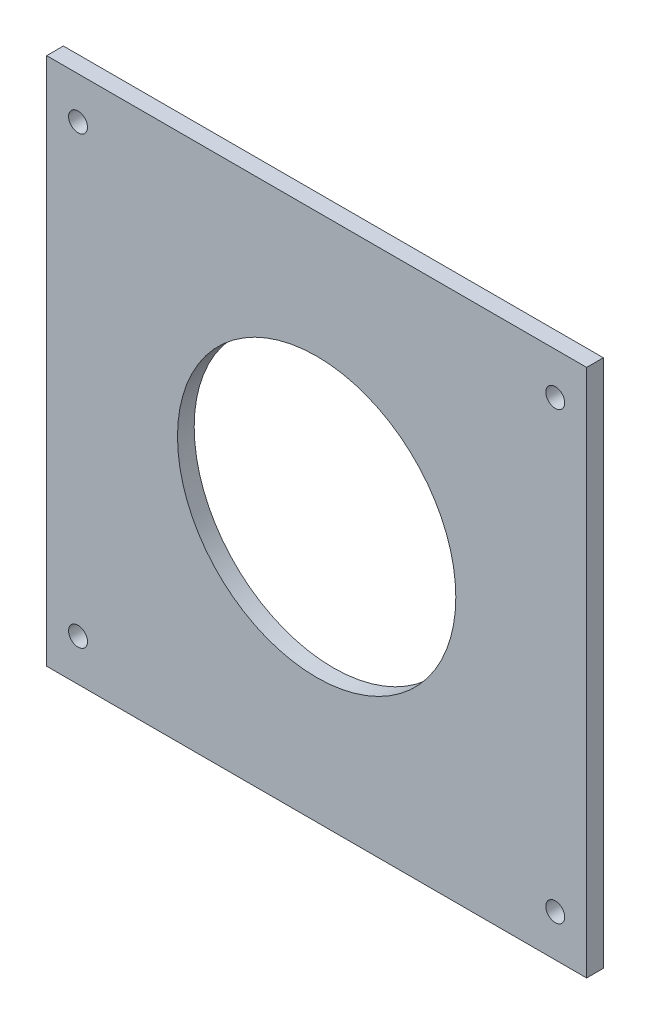
ISO-10303-21;
HEADER;
FILE_DESCRIPTION(('STEP AP214'),'2;1');
FILE_NAME('part.step','',(''),(''),'','','');
FILE_SCHEMA(('AUTOMOTIVE_DESIGN { 1 0 10303 214 1 1 1 1 }'));
ENDSEC;
DATA;
#1=APPLICATION_CONTEXT('core data for automotive mechanical design processes');
#2=APPLICATION_PROTOCOL_DEFINITION('international standard','automotive_design',2000,#1);
#3=PRODUCT_CONTEXT('',#1,'mechanical');
#4=PRODUCT('Part','Part','',(#3));
#5=PRODUCT_RELATED_PRODUCT_CATEGORY('part','',(#4));
#6=PRODUCT_DEFINITION_FORMATION('','',#4);
#7=PRODUCT_DEFINITION_CONTEXT('part definition',#1,'design');
#8=PRODUCT_DEFINITION('design','',#6,#7);
#9=PRODUCT_DEFINITION_SHAPE('','',#8);
#10=(LENGTH_UNIT() NAMED_UNIT(*) SI_UNIT(.MILLI.,.METRE.));
#11=(NAMED_UNIT(*) PLANE_ANGLE_UNIT() SI_UNIT($,.RADIAN.));
#12=(NAMED_UNIT(*) SI_UNIT($,.STERADIAN.) SOLID_ANGLE_UNIT());
#13=UNCERTAINTY_MEASURE_WITH_UNIT(LENGTH_MEASURE(1.E-05),#10,'distance_accuracy_value','');
#14=(GEOMETRIC_REPRESENTATION_CONTEXT(3) GLOBAL_UNCERTAINTY_ASSIGNED_CONTEXT((#13)) GLOBAL_UNIT_ASSIGNED_CONTEXT((#10,
#11,#12)) REPRESENTATION_CONTEXT('',''));
#15=CARTESIAN_POINT('',(0.,0.,0.));
#16=DIRECTION('',(0.,0.,1.));
#17=DIRECTION('',(1.,0.,0.));
#18=AXIS2_PLACEMENT_3D('',#15,#16,#17);
#19=CARTESIAN_POINT('',(0.,0.,3.));
#20=DIRECTION('',(1.,0.,0.));
#21=DIRECTION('',(0.,0.,-1.));
#22=AXIS2_PLACEMENT_3D('',#19,#20,#21);
#23=PLANE('',#22);
#24=DIRECTION('',(0.,-1.,0.));
#25=VECTOR('',#24,1.);
#26=CARTESIAN_POINT('',(0.,0.,0.));
#27=LINE('',#26,#25);
#28=CARTESIAN_POINT('',(0.,95.,0.));
#29=VERTEX_POINT('',#28);
#30=CARTESIAN_POINT('',(0.,0.,0.));
#31=VERTEX_POINT('',#30);
#32=EDGE_CURVE('E107',#29,#31,#27,.T.);
#33=ORIENTED_EDGE('',*,*,#32,.T.);
#34=DIRECTION('',(0.,0.,-1.));
#35=VECTOR('',#34,1.);
#36=CARTESIAN_POINT('',(0.,0.,3.));
#37=LINE('',#36,#35);
#38=CARTESIAN_POINT('',(0.,0.,3.));
#39=VERTEX_POINT('',#38);
#40=EDGE_CURVE('E11',#39,#31,#37,.T.);
#41=ORIENTED_EDGE('',*,*,#40,.F.);
#42=DIRECTION('',(0.,-1.,0.));
#43=VECTOR('',#42,1.);
#44=CARTESIAN_POINT('',(0.,0.,3.));
#45=LINE('',#44,#43);
#46=CARTESIAN_POINT('',(0.,95.,3.));
#47=VERTEX_POINT('',#46);
#48=EDGE_CURVE('E94',#47,#39,#45,.T.);
#49=ORIENTED_EDGE('',*,*,#48,.F.);
#50=DIRECTION('',(0.,0.,-1.));
#51=VECTOR('',#50,1.);
#52=CARTESIAN_POINT('',(0.,95.,3.));
#53=LINE('',#52,#51);
#54=EDGE_CURVE('E103',#47,#29,#53,.T.);
#55=ORIENTED_EDGE('',*,*,#54,.T.);
#56=EDGE_LOOP('',(#33,#41,#49,#55));
#57=FACE_BOUND('',#56,.T.);
#58=ADVANCED_FACE('F41',(#57),#23,.F.);
#59=CARTESIAN_POINT('',(0.,0.,3.));
#60=DIRECTION('',(0.,1.,0.));
#61=DIRECTION('',(0.,0.,1.));
#62=AXIS2_PLACEMENT_3D('',#59,#60,#61);
#63=PLANE('',#62);
#64=DIRECTION('',(1.,0.,0.));
#65=VECTOR('',#64,1.);
#66=CARTESIAN_POINT('',(0.,0.,0.));
#67=LINE('',#66,#65);
#68=CARTESIAN_POINT('',(97.,0.,0.));
#69=VERTEX_POINT('',#68);
#70=EDGE_CURVE('E98',#31,#69,#67,.T.);
#71=ORIENTED_EDGE('',*,*,#70,.T.);
#72=DIRECTION('',(0.,0.,-1.));
#73=VECTOR('',#72,1.);
#74=CARTESIAN_POINT('',(97.,0.,3.));
#75=LINE('',#74,#73);
#76=CARTESIAN_POINT('',(97.,0.,3.));
#77=VERTEX_POINT('',#76);
#78=EDGE_CURVE('E50',#77,#69,#75,.T.);
#79=ORIENTED_EDGE('',*,*,#78,.F.);
#80=DIRECTION('',(1.,0.,0.));
#81=VECTOR('',#80,1.);
#82=CARTESIAN_POINT('',(0.,0.,3.));
#83=LINE('',#82,#81);
#84=EDGE_CURVE('E89',#39,#77,#83,.T.);
#85=ORIENTED_EDGE('',*,*,#84,.F.);
#86=ORIENTED_EDGE('',*,*,#40,.T.);
#87=EDGE_LOOP('',(#71,#79,#85,#86));
#88=FACE_BOUND('',#87,.T.);
#89=ADVANCED_FACE('F97',(#88),#63,.F.);
#90=CARTESIAN_POINT('',(97.,0.,3.));
#91=DIRECTION('',(-1.,0.,0.));
#92=DIRECTION('',(0.,0.,1.));
#93=AXIS2_PLACEMENT_3D('',#90,#91,#92);
#94=PLANE('',#93);
#95=DIRECTION('',(0.,1.,0.));
#96=VECTOR('',#95,1.);
#97=CARTESIAN_POINT('',(97.,0.,0.));
#98=LINE('',#97,#96);
#99=CARTESIAN_POINT('',(97.,95.,0.));
#100=VERTEX_POINT('',#99);
#101=EDGE_CURVE('E76',#69,#100,#98,.T.);
#102=ORIENTED_EDGE('',*,*,#101,.T.);
#103=DIRECTION('',(0.,0.,-1.));
#104=VECTOR('',#103,1.);
#105=CARTESIAN_POINT('',(97.,95.,3.));
#106=LINE('',#105,#104);
#107=CARTESIAN_POINT('',(97.,95.,3.));
#108=VERTEX_POINT('',#107);
#109=EDGE_CURVE('E99',#108,#100,#106,.T.);
#110=ORIENTED_EDGE('',*,*,#109,.F.);
#111=DIRECTION('',(0.,1.,0.));
#112=VECTOR('',#111,1.);
#113=CARTESIAN_POINT('',(97.,0.,3.));
#114=LINE('',#113,#112);
#115=EDGE_CURVE('E92',#77,#108,#114,.T.);
#116=ORIENTED_EDGE('',*,*,#115,.F.);
#117=ORIENTED_EDGE('',*,*,#78,.T.);
#118=EDGE_LOOP('',(#102,#110,#116,#117));
#119=FACE_BOUND('',#118,.T.);
#120=ADVANCED_FACE('F101',(#119),#94,.F.);
#121=CARTESIAN_POINT('',(0.,95.,3.));
#122=DIRECTION('',(0.,-1.,0.));
#123=DIRECTION('',(0.,0.,-1.));
#124=AXIS2_PLACEMENT_3D('',#121,#122,#123);
#125=PLANE('',#124);
#126=DIRECTION('',(-1.,0.,0.));
#127=VECTOR('',#126,1.);
#128=CARTESIAN_POINT('',(0.,95.,0.));
#129=LINE('',#128,#127);
#130=EDGE_CURVE('E82',#100,#29,#129,.T.);
#131=ORIENTED_EDGE('',*,*,#130,.T.);
#132=ORIENTED_EDGE('',*,*,#54,.F.);
#133=DIRECTION('',(-1.,0.,0.));
#134=VECTOR('',#133,1.);
#135=CARTESIAN_POINT('',(0.,95.,3.));
#136=LINE('',#135,#134);
#137=EDGE_CURVE('E59',#108,#47,#136,.T.);
#138=ORIENTED_EDGE('',*,*,#137,.F.);
#139=ORIENTED_EDGE('',*,*,#109,.T.);
#140=EDGE_LOOP('',(#131,#132,#138,#139));
#141=FACE_BOUND('',#140,.T.);
#142=ADVANCED_FACE('F148',(#141),#125,.F.);
#143=CARTESIAN_POINT('',(0.,0.,3.));
#144=DIRECTION('',(0.,0.,-1.));
#145=DIRECTION('',(-1.,0.,0.));
#146=AXIS2_PLACEMENT_3D('',#143,#144,#145);
#147=PLANE('',#146);
#148=CARTESIAN_POINT('',(91.365,7.495,3.));
#149=DIRECTION('',(0.,0.,1.));
#150=DIRECTION('',(1.,0.,0.));
#151=AXIS2_PLACEMENT_3D('',#148,#149,#150);
#152=CIRCLE('',#151,1.69999999999999);
#153=CARTESIAN_POINT('',(93.065,7.495,3.));
#154=VERTEX_POINT('',#153);
#155=EDGE_CURVE('E240',#154,#154,#152,.T.);
#156=ORIENTED_EDGE('',*,*,#155,.F.);
#157=EDGE_LOOP('',(#156));
#158=FACE_BOUND('',#157,.T.);
#159=CARTESIAN_POINT('',(5.635,87.505,3.));
#160=DIRECTION('',(0.,0.,1.));
#161=DIRECTION('',(1.,0.,0.));
#162=AXIS2_PLACEMENT_3D('',#159,#160,#161);
#163=CIRCLE('',#162,1.7);
#164=CARTESIAN_POINT('',(7.335,87.505,3.));
#165=VERTEX_POINT('',#164);
#166=EDGE_CURVE('E238',#165,#165,#163,.T.);
#167=ORIENTED_EDGE('',*,*,#166,.F.);
#168=EDGE_LOOP('',(#167));
#169=FACE_BOUND('',#168,.T.);
#170=CARTESIAN_POINT('',(91.365,87.505,3.));
#171=DIRECTION('',(0.,0.,1.));
#172=DIRECTION('',(1.,0.,0.));
#173=AXIS2_PLACEMENT_3D('',#170,#171,#172);
#174=CIRCLE('',#173,1.69999999999999);
#175=CARTESIAN_POINT('',(93.065,87.505,3.));
#176=VERTEX_POINT('',#175);
#177=EDGE_CURVE('E241',#176,#176,#174,.T.);
#178=ORIENTED_EDGE('',*,*,#177,.F.);
#179=EDGE_LOOP('',(#178));
#180=FACE_BOUND('',#179,.T.);
#181=CARTESIAN_POINT('',(48.5,47.5,3.));
#182=DIRECTION('',(0.,0.,1.));
#183=DIRECTION('',(1.,0.,0.));
#184=AXIS2_PLACEMENT_3D('',#181,#182,#183);
#185=CIRCLE('',#184,25.);
#186=CARTESIAN_POINT('',(73.5,47.5,3.));
#187=VERTEX_POINT('',#186);
#188=EDGE_CURVE('E246',#187,#187,#185,.T.);
#189=ORIENTED_EDGE('',*,*,#188,.F.);
#190=EDGE_LOOP('',(#189));
#191=FACE_BOUND('',#190,.T.);
#192=CARTESIAN_POINT('',(5.635,7.495,3.));
#193=DIRECTION('',(0.,0.,1.));
#194=DIRECTION('',(1.,0.,0.));
#195=AXIS2_PLACEMENT_3D('',#192,#193,#194);
#196=CIRCLE('',#195,1.7);
#197=CARTESIAN_POINT('',(7.335,7.495,3.));
#198=VERTEX_POINT('',#197);
#199=EDGE_CURVE('E119',#198,#198,#196,.T.);
#200=ORIENTED_EDGE('',*,*,#199,.F.);
#201=EDGE_LOOP('',(#200));
#202=FACE_BOUND('',#201,.T.);
#203=ORIENTED_EDGE('',*,*,#48,.T.);
#204=ORIENTED_EDGE('',*,*,#84,.T.);
#205=ORIENTED_EDGE('',*,*,#115,.T.);
#206=ORIENTED_EDGE('',*,*,#137,.T.);
#207=EDGE_LOOP('',(#203,#204,#205,#206));
#208=FACE_BOUND('',#207,.T.);
#209=ADVANCED_FACE('F90',(#158,#169,#180,#191,#202,#208),#147,.F.);
#210=CARTESIAN_POINT('',(0.,0.,0.));
#211=DIRECTION('',(0.,0.,-1.));
#212=DIRECTION('',(-1.,0.,0.));
#213=AXIS2_PLACEMENT_3D('',#210,#211,#212);
#214=PLANE('',#213);
#215=CARTESIAN_POINT('',(91.365,7.495,0.));
#216=DIRECTION('',(0.,0.,-1.));
#217=DIRECTION('',(-1.,0.,0.));
#218=AXIS2_PLACEMENT_3D('',#215,#216,#217);
#219=CIRCLE('',#218,1.69999999999999);
#220=CARTESIAN_POINT('',(93.065,7.495,0.));
#221=VERTEX_POINT('',#220);
#222=EDGE_CURVE('E44',#221,#221,#219,.T.);
#223=ORIENTED_EDGE('',*,*,#222,.F.);
#224=EDGE_LOOP('',(#223));
#225=FACE_BOUND('',#224,.T.);
#226=CARTESIAN_POINT('',(5.635,87.505,0.));
#227=DIRECTION('',(0.,0.,-1.));
#228=DIRECTION('',(-1.,0.,0.));
#229=AXIS2_PLACEMENT_3D('',#226,#227,#228);
#230=CIRCLE('',#229,1.7);
#231=CARTESIAN_POINT('',(7.335,87.505,0.));
#232=VERTEX_POINT('',#231);
#233=EDGE_CURVE('E124',#232,#232,#230,.T.);
#234=ORIENTED_EDGE('',*,*,#233,.F.);
#235=EDGE_LOOP('',(#234));
#236=FACE_BOUND('',#235,.T.);
#237=CARTESIAN_POINT('',(91.365,87.505,0.));
#238=DIRECTION('',(0.,0.,-1.));
#239=DIRECTION('',(-1.,0.,0.));
#240=AXIS2_PLACEMENT_3D('',#237,#238,#239);
#241=CIRCLE('',#240,1.69999999999999);
#242=CARTESIAN_POINT('',(93.065,87.505,0.));
#243=VERTEX_POINT('',#242);
#244=EDGE_CURVE('E122',#243,#243,#241,.T.);
#245=ORIENTED_EDGE('',*,*,#244,.F.);
#246=EDGE_LOOP('',(#245));
#247=FACE_BOUND('',#246,.T.);
#248=CARTESIAN_POINT('',(48.5,47.5,0.));
#249=DIRECTION('',(0.,0.,-1.));
#250=DIRECTION('',(-1.,0.,0.));
#251=AXIS2_PLACEMENT_3D('',#248,#249,#250);
#252=CIRCLE('',#251,25.);
#253=CARTESIAN_POINT('',(73.5,47.5,0.));
#254=VERTEX_POINT('',#253);
#255=EDGE_CURVE('E118',#254,#254,#252,.T.);
#256=ORIENTED_EDGE('',*,*,#255,.F.);
#257=EDGE_LOOP('',(#256));
#258=FACE_BOUND('',#257,.T.);
#259=CARTESIAN_POINT('',(5.635,7.495,0.));
#260=DIRECTION('',(0.,0.,-1.));
#261=DIRECTION('',(-1.,0.,0.));
#262=AXIS2_PLACEMENT_3D('',#259,#260,#261);
#263=CIRCLE('',#262,1.7);
#264=CARTESIAN_POINT('',(7.335,7.495,0.));
#265=VERTEX_POINT('',#264);
#266=EDGE_CURVE('E115',#265,#265,#263,.T.);
#267=ORIENTED_EDGE('',*,*,#266,.F.);
#268=EDGE_LOOP('',(#267));
#269=FACE_BOUND('',#268,.T.);
#270=ORIENTED_EDGE('',*,*,#32,.F.);
#271=ORIENTED_EDGE('',*,*,#130,.F.);
#272=ORIENTED_EDGE('',*,*,#101,.F.);
#273=ORIENTED_EDGE('',*,*,#70,.F.);
#274=EDGE_LOOP('',(#270,#271,#272,#273));
#275=FACE_BOUND('',#274,.T.);
#276=ADVANCED_FACE('F134',(#225,#236,#247,#258,#269,#275),#214,.T.);
#277=CARTESIAN_POINT('',(5.635,7.495,-1.2E-05));
#278=DIRECTION('',(0.,0.,1.));
#279=DIRECTION('',(1.,0.,0.));
#280=AXIS2_PLACEMENT_3D('',#277,#278,#279);
#281=CYLINDRICAL_SURFACE('',#280,1.7);
#282=CARTESIAN_POINT('',(7.335,7.495,0.));
#283=CARTESIAN_POINT('',(7.335,7.495,0.03125));
#284=CARTESIAN_POINT('',(7.335,7.495,0.0625));
#285=CARTESIAN_POINT('',(7.335,7.495,0.125));
#286=CARTESIAN_POINT('',(7.335,7.495,0.15625));
#287=CARTESIAN_POINT('',(7.335,7.495,0.21875));
#288=CARTESIAN_POINT('',(7.335,7.495,0.25));
#289=CARTESIAN_POINT('',(7.335,7.495,0.3125));
#290=CARTESIAN_POINT('',(7.335,7.495,0.34375));
#291=CARTESIAN_POINT('',(7.335,7.495,0.40625));
#292=CARTESIAN_POINT('',(7.335,7.495,0.4375));
#293=CARTESIAN_POINT('',(7.335,7.495,0.5));
#294=CARTESIAN_POINT('',(7.335,7.495,0.53125));
#295=CARTESIAN_POINT('',(7.335,7.495,0.59375));
#296=CARTESIAN_POINT('',(7.335,7.495,0.625));
#297=CARTESIAN_POINT('',(7.335,7.495,0.6875));
#298=CARTESIAN_POINT('',(7.335,7.495,0.71875));
#299=CARTESIAN_POINT('',(7.335,7.495,0.78125));
#300=CARTESIAN_POINT('',(7.335,7.495,0.8125));
#301=CARTESIAN_POINT('',(7.335,7.495,0.875));
#302=CARTESIAN_POINT('',(7.335,7.495,0.90625));
#303=CARTESIAN_POINT('',(7.335,7.495,0.96875));
#304=CARTESIAN_POINT('',(7.335,7.495,1.));
#305=CARTESIAN_POINT('',(7.335,7.495,1.0625));
#306=CARTESIAN_POINT('',(7.335,7.495,1.09375));
#307=CARTESIAN_POINT('',(7.335,7.495,1.15625));
#308=CARTESIAN_POINT('',(7.335,7.495,1.1875));
#309=CARTESIAN_POINT('',(7.335,7.495,1.25));
#310=CARTESIAN_POINT('',(7.335,7.495,1.28125));
#311=CARTESIAN_POINT('',(7.335,7.495,1.34375));
#312=CARTESIAN_POINT('',(7.335,7.495,1.375));
#313=CARTESIAN_POINT('',(7.335,7.495,1.4375));
#314=CARTESIAN_POINT('',(7.335,7.495,1.46875));
#315=CARTESIAN_POINT('',(7.335,7.495,1.53125));
#316=CARTESIAN_POINT('',(7.335,7.495,1.5625));
#317=CARTESIAN_POINT('',(7.335,7.495,1.625));
#318=CARTESIAN_POINT('',(7.335,7.495,1.65625));
#319=CARTESIAN_POINT('',(7.335,7.495,1.71875));
#320=CARTESIAN_POINT('',(7.335,7.495,1.75));
#321=CARTESIAN_POINT('',(7.335,7.495,1.8125));
#322=CARTESIAN_POINT('',(7.335,7.495,1.84375));
#323=CARTESIAN_POINT('',(7.335,7.495,1.90625));
#324=CARTESIAN_POINT('',(7.335,7.495,1.9375));
#325=CARTESIAN_POINT('',(7.335,7.495,2.));
#326=CARTESIAN_POINT('',(7.335,7.495,2.03125));
#327=CARTESIAN_POINT('',(7.335,7.495,2.09375));
#328=CARTESIAN_POINT('',(7.335,7.495,2.125));
#329=CARTESIAN_POINT('',(7.335,7.495,2.1875));
#330=CARTESIAN_POINT('',(7.335,7.495,2.21875));
#331=CARTESIAN_POINT('',(7.335,7.495,2.28125));
#332=CARTESIAN_POINT('',(7.335,7.495,2.3125));
#333=CARTESIAN_POINT('',(7.335,7.495,2.375));
#334=CARTESIAN_POINT('',(7.335,7.495,2.40625));
#335=CARTESIAN_POINT('',(7.335,7.495,2.46875));
#336=CARTESIAN_POINT('',(7.335,7.495,2.5));
#337=CARTESIAN_POINT('',(7.335,7.495,2.5625));
#338=CARTESIAN_POINT('',(7.335,7.495,2.59375));
#339=CARTESIAN_POINT('',(7.335,7.495,2.65625));
#340=CARTESIAN_POINT('',(7.335,7.495,2.6875));
#341=CARTESIAN_POINT('',(7.335,7.495,2.75));
#342=CARTESIAN_POINT('',(7.335,7.495,2.78125));
#343=CARTESIAN_POINT('',(7.335,7.495,2.84375));
#344=CARTESIAN_POINT('',(7.335,7.495,2.875));
#345=CARTESIAN_POINT('',(7.335,7.495,2.9375));
#346=CARTESIAN_POINT('',(7.335,7.495,2.96875));
#347=CARTESIAN_POINT('',(7.335,7.495,3.));
#348=B_SPLINE_CURVE_WITH_KNOTS('',3,(#282,#283,#284,#285,#286,#287,#288,#289,#290,#291,#292,
#293,#294,#295,#296,#297,#298,#299,#300,#301,#302,#303,#304,#305,#306,#307,#308,#309,#310,#311,
#312,#313,#314,#315,#316,#317,#318,#319,#320,#321,#322,#323,#324,#325,#326,#327,#328,#329,#330,
#331,#332,#333,#334,#335,#336,#337,#338,#339,#340,#341,#342,#343,#344,#345,#346,#347),
.UNSPECIFIED.,.F.,.F.,(4,2,2,2,2,2,2,2,2,2,2,2,2,2,2,2,2,2,2,2,2,2,2,2,2,2,2,2,2,2,2,2,4),(0.,
0.09375,0.1875,0.28125,0.375,0.46875,0.5625,0.65625,0.75,0.84375,0.9375,1.03125,1.125,1.21875,
1.3125,1.40625,1.5,1.59375,1.6875,1.78125,1.875,1.96875,2.0625,2.15625,2.25,2.34375,2.4375,
2.53125,2.625,2.71875,2.8125,2.90625,3.),.UNSPECIFIED.);
#349=EDGE_CURVE('BSEAM137',#265,#198,#348,.T.);
#350=ORIENTED_EDGE('',*,*,#266,.T.);
#351=ORIENTED_EDGE('',*,*,#199,.T.);
#352=ORIENTED_EDGE('',*,*,#349,.T.);
#353=ORIENTED_EDGE('',*,*,#349,.F.);
#354=EDGE_LOOP('',(#350,#352,#351,#353));
#355=FACE_BOUND('',#354,.T.);
#356=ADVANCED_FACE('F137',(#355),#281,.F.);
#357=CARTESIAN_POINT('',(48.5,47.5,-1.2E-05));
#358=DIRECTION('',(0.,0.,1.));
#359=DIRECTION('',(1.,0.,0.));
#360=AXIS2_PLACEMENT_3D('',#357,#358,#359);
#361=CYLINDRICAL_SURFACE('',#360,25.);
#362=CARTESIAN_POINT('',(73.5,47.5,0.));
#363=CARTESIAN_POINT('',(73.5,47.5,0.03125));
#364=CARTESIAN_POINT('',(73.5,47.5,0.0625));
#365=CARTESIAN_POINT('',(73.5,47.5,0.125));
#366=CARTESIAN_POINT('',(73.5,47.5,0.15625));
#367=CARTESIAN_POINT('',(73.5,47.5,0.21875));
#368=CARTESIAN_POINT('',(73.5,47.5,0.25));
#369=CARTESIAN_POINT('',(73.5,47.5,0.3125));
#370=CARTESIAN_POINT('',(73.5,47.5,0.34375));
#371=CARTESIAN_POINT('',(73.5,47.5,0.40625));
#372=CARTESIAN_POINT('',(73.5,47.5,0.4375));
#373=CARTESIAN_POINT('',(73.5,47.5,0.5));
#374=CARTESIAN_POINT('',(73.5,47.5,0.53125));
#375=CARTESIAN_POINT('',(73.5,47.5,0.59375));
#376=CARTESIAN_POINT('',(73.5,47.5,0.625));
#377=CARTESIAN_POINT('',(73.5,47.5,0.6875));
#378=CARTESIAN_POINT('',(73.5,47.5,0.71875));
#379=CARTESIAN_POINT('',(73.5,47.5,0.78125));
#380=CARTESIAN_POINT('',(73.5,47.5,0.8125));
#381=CARTESIAN_POINT('',(73.5,47.5,0.875));
#382=CARTESIAN_POINT('',(73.5,47.5,0.90625));
#383=CARTESIAN_POINT('',(73.5,47.5,0.96875));
#384=CARTESIAN_POINT('',(73.5,47.5,1.));
#385=CARTESIAN_POINT('',(73.5,47.5,1.0625));
#386=CARTESIAN_POINT('',(73.5,47.5,1.09375));
#387=CARTESIAN_POINT('',(73.5,47.5,1.15625));
#388=CARTESIAN_POINT('',(73.5,47.5,1.1875));
#389=CARTESIAN_POINT('',(73.5,47.5,1.25));
#390=CARTESIAN_POINT('',(73.5,47.5,1.28125));
#391=CARTESIAN_POINT('',(73.5,47.5,1.34375));
#392=CARTESIAN_POINT('',(73.5,47.5,1.375));
#393=CARTESIAN_POINT('',(73.5,47.5,1.4375));
#394=CARTESIAN_POINT('',(73.5,47.5,1.46875));
#395=CARTESIAN_POINT('',(73.5,47.5,1.53125));
#396=CARTESIAN_POINT('',(73.5,47.5,1.5625));
#397=CARTESIAN_POINT('',(73.5,47.5,1.625));
#398=CARTESIAN_POINT('',(73.5,47.5,1.65625));
#399=CARTESIAN_POINT('',(73.5,47.5,1.71875));
#400=CARTESIAN_POINT('',(73.5,47.5,1.75));
#401=CARTESIAN_POINT('',(73.5,47.5,1.8125));
#402=CARTESIAN_POINT('',(73.5,47.5,1.84375));
#403=CARTESIAN_POINT('',(73.5,47.5,1.90625));
#404=CARTESIAN_POINT('',(73.5,47.5,1.9375));
#405=CARTESIAN_POINT('',(73.5,47.5,2.));
#406=CARTESIAN_POINT('',(73.5,47.5,2.03125));
#407=CARTESIAN_POINT('',(73.5,47.5,2.09375));
#408=CARTESIAN_POINT('',(73.5,47.5,2.125));
#409=CARTESIAN_POINT('',(73.5,47.5,2.1875));
#410=CARTESIAN_POINT('',(73.5,47.5,2.21875));
#411=CARTESIAN_POINT('',(73.5,47.5,2.28125));
#412=CARTESIAN_POINT('',(73.5,47.5,2.3125));
#413=CARTESIAN_POINT('',(73.5,47.5,2.375));
#414=CARTESIAN_POINT('',(73.5,47.5,2.40625));
#415=CARTESIAN_POINT('',(73.5,47.5,2.46875));
#416=CARTESIAN_POINT('',(73.5,47.5,2.5));
#417=CARTESIAN_POINT('',(73.5,47.5,2.5625));
#418=CARTESIAN_POINT('',(73.5,47.5,2.59375));
#419=CARTESIAN_POINT('',(73.5,47.5,2.65625));
#420=CARTESIAN_POINT('',(73.5,47.5,2.6875));
#421=CARTESIAN_POINT('',(73.5,47.5,2.75));
#422=CARTESIAN_POINT('',(73.5,47.5,2.78125));
#423=CARTESIAN_POINT('',(73.5,47.5,2.84375));
#424=CARTESIAN_POINT('',(73.5,47.5,2.875));
#425=CARTESIAN_POINT('',(73.5,47.5,2.9375));
#426=CARTESIAN_POINT('',(73.5,47.5,2.96875));
#427=CARTESIAN_POINT('',(73.5,47.5,3.));
#428=B_SPLINE_CURVE_WITH_KNOTS('',3,(#362,#363,#364,#365,#366,#367,#368,#369,#370,#371,#372,
#373,#374,#375,#376,#377,#378,#379,#380,#381,#382,#383,#384,#385,#386,#387,#388,#389,#390,#391,
#392,#393,#394,#395,#396,#397,#398,#399,#400,#401,#402,#403,#404,#405,#406,#407,#408,#409,#410,
#411,#412,#413,#414,#415,#416,#417,#418,#419,#420,#421,#422,#423,#424,#425,#426,#427),
.UNSPECIFIED.,.F.,.F.,(4,2,2,2,2,2,2,2,2,2,2,2,2,2,2,2,2,2,2,2,2,2,2,2,2,2,2,2,2,2,2,2,4),(0.,
0.09375,0.1875,0.28125,0.375,0.46875,0.5625,0.65625,0.75,0.84375,0.9375,1.03125,1.125,1.21875,
1.3125,1.40625,1.5,1.59375,1.6875,1.78125,1.875,1.96875,2.0625,2.15625,2.25,2.34375,2.4375,
2.53125,2.625,2.71875,2.8125,2.90625,3.),.UNSPECIFIED.);
#429=EDGE_CURVE('BSEAM195',#254,#187,#428,.T.);
#430=ORIENTED_EDGE('',*,*,#255,.T.);
#431=ORIENTED_EDGE('',*,*,#188,.T.);
#432=ORIENTED_EDGE('',*,*,#429,.T.);
#433=ORIENTED_EDGE('',*,*,#429,.F.);
#434=EDGE_LOOP('',(#430,#432,#431,#433));
#435=FACE_BOUND('',#434,.T.);
#436=ADVANCED_FACE('F195',(#435),#361,.F.);
#437=CARTESIAN_POINT('',(91.365,87.505,-1.2E-05));
#438=DIRECTION('',(0.,0.,1.));
#439=DIRECTION('',(1.,0.,0.));
#440=AXIS2_PLACEMENT_3D('',#437,#438,#439);
#441=CYLINDRICAL_SURFACE('',#440,1.69999999999999);
#442=CARTESIAN_POINT('',(93.065,87.505,0.));
#443=CARTESIAN_POINT('',(93.065,87.505,0.03125));
#444=CARTESIAN_POINT('',(93.065,87.505,0.0625));
#445=CARTESIAN_POINT('',(93.065,87.505,0.125));
#446=CARTESIAN_POINT('',(93.065,87.505,0.15625));
#447=CARTESIAN_POINT('',(93.065,87.505,0.21875));
#448=CARTESIAN_POINT('',(93.065,87.505,0.25));
#449=CARTESIAN_POINT('',(93.065,87.505,0.3125));
#450=CARTESIAN_POINT('',(93.065,87.505,0.34375));
#451=CARTESIAN_POINT('',(93.065,87.505,0.40625));
#452=CARTESIAN_POINT('',(93.065,87.505,0.4375));
#453=CARTESIAN_POINT('',(93.065,87.505,0.5));
#454=CARTESIAN_POINT('',(93.065,87.505,0.53125));
#455=CARTESIAN_POINT('',(93.065,87.505,0.59375));
#456=CARTESIAN_POINT('',(93.065,87.505,0.625));
#457=CARTESIAN_POINT('',(93.065,87.505,0.6875));
#458=CARTESIAN_POINT('',(93.065,87.505,0.71875));
#459=CARTESIAN_POINT('',(93.065,87.505,0.78125));
#460=CARTESIAN_POINT('',(93.065,87.505,0.8125));
#461=CARTESIAN_POINT('',(93.065,87.505,0.875));
#462=CARTESIAN_POINT('',(93.065,87.505,0.90625));
#463=CARTESIAN_POINT('',(93.065,87.505,0.96875));
#464=CARTESIAN_POINT('',(93.065,87.505,1.));
#465=CARTESIAN_POINT('',(93.065,87.505,1.0625));
#466=CARTESIAN_POINT('',(93.065,87.505,1.09375));
#467=CARTESIAN_POINT('',(93.065,87.505,1.15625));
#468=CARTESIAN_POINT('',(93.065,87.505,1.1875));
#469=CARTESIAN_POINT('',(93.065,87.505,1.25));
#470=CARTESIAN_POINT('',(93.065,87.505,1.28125));
#471=CARTESIAN_POINT('',(93.065,87.505,1.34375));
#472=CARTESIAN_POINT('',(93.065,87.505,1.375));
#473=CARTESIAN_POINT('',(93.065,87.505,1.4375));
#474=CARTESIAN_POINT('',(93.065,87.505,1.46875));
#475=CARTESIAN_POINT('',(93.065,87.505,1.53125));
#476=CARTESIAN_POINT('',(93.065,87.505,1.5625));
#477=CARTESIAN_POINT('',(93.065,87.505,1.625));
#478=CARTESIAN_POINT('',(93.065,87.505,1.65625));
#479=CARTESIAN_POINT('',(93.065,87.505,1.71875));
#480=CARTESIAN_POINT('',(93.065,87.505,1.75));
#481=CARTESIAN_POINT('',(93.065,87.505,1.8125));
#482=CARTESIAN_POINT('',(93.065,87.505,1.84375));
#483=CARTESIAN_POINT('',(93.065,87.505,1.90625));
#484=CARTESIAN_POINT('',(93.065,87.505,1.9375));
#485=CARTESIAN_POINT('',(93.065,87.505,2.));
#486=CARTESIAN_POINT('',(93.065,87.505,2.03125));
#487=CARTESIAN_POINT('',(93.065,87.505,2.09375));
#488=CARTESIAN_POINT('',(93.065,87.505,2.125));
#489=CARTESIAN_POINT('',(93.065,87.505,2.1875));
#490=CARTESIAN_POINT('',(93.065,87.505,2.21875));
#491=CARTESIAN_POINT('',(93.065,87.505,2.28125));
#492=CARTESIAN_POINT('',(93.065,87.505,2.3125));
#493=CARTESIAN_POINT('',(93.065,87.505,2.375));
#494=CARTESIAN_POINT('',(93.065,87.505,2.40625));
#495=CARTESIAN_POINT('',(93.065,87.505,2.46875));
#496=CARTESIAN_POINT('',(93.065,87.505,2.5));
#497=CARTESIAN_POINT('',(93.065,87.505,2.5625));
#498=CARTESIAN_POINT('',(93.065,87.505,2.59375));
#499=CARTESIAN_POINT('',(93.065,87.505,2.65625));
#500=CARTESIAN_POINT('',(93.065,87.505,2.6875));
#501=CARTESIAN_POINT('',(93.065,87.505,2.75));
#502=CARTESIAN_POINT('',(93.065,87.505,2.78125));
#503=CARTESIAN_POINT('',(93.065,87.505,2.84375));
#504=CARTESIAN_POINT('',(93.065,87.505,2.875));
#505=CARTESIAN_POINT('',(93.065,87.505,2.9375));
#506=CARTESIAN_POINT('',(93.065,87.505,2.96875));
#507=CARTESIAN_POINT('',(93.065,87.505,3.));
#508=B_SPLINE_CURVE_WITH_KNOTS('',3,(#442,#443,#444,#445,#446,#447,#448,#449,#450,#451,#452,
#453,#454,#455,#456,#457,#458,#459,#460,#461,#462,#463,#464,#465,#466,#467,#468,#469,#470,#471,
#472,#473,#474,#475,#476,#477,#478,#479,#480,#481,#482,#483,#484,#485,#486,#487,#488,#489,#490,
#491,#492,#493,#494,#495,#496,#497,#498,#499,#500,#501,#502,#503,#504,#505,#506,#507),
.UNSPECIFIED.,.F.,.F.,(4,2,2,2,2,2,2,2,2,2,2,2,2,2,2,2,2,2,2,2,2,2,2,2,2,2,2,2,2,2,2,2,4),(0.,
0.09375,0.1875,0.28125,0.375,0.46875,0.5625,0.65625,0.75,0.84375,0.9375,1.03125,1.125,1.21875,
1.3125,1.40625,1.5,1.59375,1.6875,1.78125,1.875,1.96875,2.0625,2.15625,2.25,2.34375,2.4375,
2.53125,2.625,2.71875,2.8125,2.90625,3.),.UNSPECIFIED.);
#509=EDGE_CURVE('BSEAM205',#243,#176,#508,.T.);
#510=ORIENTED_EDGE('',*,*,#244,.T.);
#511=ORIENTED_EDGE('',*,*,#177,.T.);
#512=ORIENTED_EDGE('',*,*,#509,.T.);
#513=ORIENTED_EDGE('',*,*,#509,.F.);
#514=EDGE_LOOP('',(#510,#512,#511,#513));
#515=FACE_BOUND('',#514,.T.);
#516=ADVANCED_FACE('F205',(#515),#441,.F.);
#517=CARTESIAN_POINT('',(5.635,87.505,-1.2E-05));
#518=DIRECTION('',(0.,0.,1.));
#519=DIRECTION('',(1.,0.,0.));
#520=AXIS2_PLACEMENT_3D('',#517,#518,#519);
#521=CYLINDRICAL_SURFACE('',#520,1.7);
#522=CARTESIAN_POINT('',(7.335,87.505,0.));
#523=CARTESIAN_POINT('',(7.335,87.505,0.03125));
#524=CARTESIAN_POINT('',(7.335,87.505,0.0625));
#525=CARTESIAN_POINT('',(7.335,87.505,0.125));
#526=CARTESIAN_POINT('',(7.335,87.505,0.15625));
#527=CARTESIAN_POINT('',(7.335,87.505,0.21875));
#528=CARTESIAN_POINT('',(7.335,87.505,0.25));
#529=CARTESIAN_POINT('',(7.335,87.505,0.3125));
#530=CARTESIAN_POINT('',(7.335,87.505,0.34375));
#531=CARTESIAN_POINT('',(7.335,87.505,0.40625));
#532=CARTESIAN_POINT('',(7.335,87.505,0.4375));
#533=CARTESIAN_POINT('',(7.335,87.505,0.5));
#534=CARTESIAN_POINT('',(7.335,87.505,0.53125));
#535=CARTESIAN_POINT('',(7.335,87.505,0.59375));
#536=CARTESIAN_POINT('',(7.335,87.505,0.625));
#537=CARTESIAN_POINT('',(7.335,87.505,0.6875));
#538=CARTESIAN_POINT('',(7.335,87.505,0.71875));
#539=CARTESIAN_POINT('',(7.335,87.505,0.78125));
#540=CARTESIAN_POINT('',(7.335,87.505,0.8125));
#541=CARTESIAN_POINT('',(7.335,87.505,0.875));
#542=CARTESIAN_POINT('',(7.335,87.505,0.90625));
#543=CARTESIAN_POINT('',(7.335,87.505,0.96875));
#544=CARTESIAN_POINT('',(7.335,87.505,1.));
#545=CARTESIAN_POINT('',(7.335,87.505,1.0625));
#546=CARTESIAN_POINT('',(7.335,87.505,1.09375));
#547=CARTESIAN_POINT('',(7.335,87.505,1.15625));
#548=CARTESIAN_POINT('',(7.335,87.505,1.1875));
#549=CARTESIAN_POINT('',(7.335,87.505,1.25));
#550=CARTESIAN_POINT('',(7.335,87.505,1.28125));
#551=CARTESIAN_POINT('',(7.335,87.505,1.34375));
#552=CARTESIAN_POINT('',(7.335,87.505,1.375));
#553=CARTESIAN_POINT('',(7.335,87.505,1.4375));
#554=CARTESIAN_POINT('',(7.335,87.505,1.46875));
#555=CARTESIAN_POINT('',(7.335,87.505,1.53125));
#556=CARTESIAN_POINT('',(7.335,87.505,1.5625));
#557=CARTESIAN_POINT('',(7.335,87.505,1.625));
#558=CARTESIAN_POINT('',(7.335,87.505,1.65625));
#559=CARTESIAN_POINT('',(7.335,87.505,1.71875));
#560=CARTESIAN_POINT('',(7.335,87.505,1.75));
#561=CARTESIAN_POINT('',(7.335,87.505,1.8125));
#562=CARTESIAN_POINT('',(7.335,87.505,1.84375));
#563=CARTESIAN_POINT('',(7.335,87.505,1.90625));
#564=CARTESIAN_POINT('',(7.335,87.505,1.9375));
#565=CARTESIAN_POINT('',(7.335,87.505,2.));
#566=CARTESIAN_POINT('',(7.335,87.505,2.03125));
#567=CARTESIAN_POINT('',(7.335,87.505,2.09375));
#568=CARTESIAN_POINT('',(7.335,87.505,2.125));
#569=CARTESIAN_POINT('',(7.335,87.505,2.1875));
#570=CARTESIAN_POINT('',(7.335,87.505,2.21875));
#571=CARTESIAN_POINT('',(7.335,87.505,2.28125));
#572=CARTESIAN_POINT('',(7.335,87.505,2.3125));
#573=CARTESIAN_POINT('',(7.335,87.505,2.375));
#574=CARTESIAN_POINT('',(7.335,87.505,2.40625));
#575=CARTESIAN_POINT('',(7.335,87.505,2.46875));
#576=CARTESIAN_POINT('',(7.335,87.505,2.5));
#577=CARTESIAN_POINT('',(7.335,87.505,2.5625));
#578=CARTESIAN_POINT('',(7.335,87.505,2.59375));
#579=CARTESIAN_POINT('',(7.335,87.505,2.65625));
#580=CARTESIAN_POINT('',(7.335,87.505,2.6875));
#581=CARTESIAN_POINT('',(7.335,87.505,2.75));
#582=CARTESIAN_POINT('',(7.335,87.505,2.78125));
#583=CARTESIAN_POINT('',(7.335,87.505,2.84375));
#584=CARTESIAN_POINT('',(7.335,87.505,2.875));
#585=CARTESIAN_POINT('',(7.335,87.505,2.9375));
#586=CARTESIAN_POINT('',(7.335,87.505,2.96875));
#587=CARTESIAN_POINT('',(7.335,87.505,3.));
#588=B_SPLINE_CURVE_WITH_KNOTS('',3,(#522,#523,#524,#525,#526,#527,#528,#529,#530,#531,#532,
#533,#534,#535,#536,#537,#538,#539,#540,#541,#542,#543,#544,#545,#546,#547,#548,#549,#550,#551,
#552,#553,#554,#555,#556,#557,#558,#559,#560,#561,#562,#563,#564,#565,#566,#567,#568,#569,#570,
#571,#572,#573,#574,#575,#576,#577,#578,#579,#580,#581,#582,#583,#584,#585,#586,#587),
.UNSPECIFIED.,.F.,.F.,(4,2,2,2,2,2,2,2,2,2,2,2,2,2,2,2,2,2,2,2,2,2,2,2,2,2,2,2,2,2,2,2,4),(0.,
0.09375,0.1875,0.28125,0.375,0.46875,0.5625,0.65625,0.75,0.84375,0.9375,1.03125,1.125,1.21875,
1.3125,1.40625,1.5,1.59375,1.6875,1.78125,1.875,1.96875,2.0625,2.15625,2.25,2.34375,2.4375,
2.53125,2.625,2.71875,2.8125,2.90625,3.),.UNSPECIFIED.);
#589=EDGE_CURVE('BSEAM215',#232,#165,#588,.T.);
#590=ORIENTED_EDGE('',*,*,#233,.T.);
#591=ORIENTED_EDGE('',*,*,#166,.T.);
#592=ORIENTED_EDGE('',*,*,#589,.T.);
#593=ORIENTED_EDGE('',*,*,#589,.F.);
#594=EDGE_LOOP('',(#590,#592,#591,#593));
#595=FACE_BOUND('',#594,.T.);
#596=ADVANCED_FACE('F215',(#595),#521,.F.);
#597=CARTESIAN_POINT('',(91.365,7.495,-1.2E-05));
#598=DIRECTION('',(0.,0.,1.));
#599=DIRECTION('',(1.,0.,0.));
#600=AXIS2_PLACEMENT_3D('',#597,#598,#599);
#601=CYLINDRICAL_SURFACE('',#600,1.69999999999999);
#602=CARTESIAN_POINT('',(93.065,7.495,0.));
#603=CARTESIAN_POINT('',(93.065,7.495,0.03125));
#604=CARTESIAN_POINT('',(93.065,7.495,0.0625));
#605=CARTESIAN_POINT('',(93.065,7.495,0.125));
#606=CARTESIAN_POINT('',(93.065,7.495,0.15625));
#607=CARTESIAN_POINT('',(93.065,7.495,0.21875));
#608=CARTESIAN_POINT('',(93.065,7.495,0.25));
#609=CARTESIAN_POINT('',(93.065,7.495,0.3125));
#610=CARTESIAN_POINT('',(93.065,7.495,0.34375));
#611=CARTESIAN_POINT('',(93.065,7.495,0.40625));
#612=CARTESIAN_POINT('',(93.065,7.495,0.4375));
#613=CARTESIAN_POINT('',(93.065,7.495,0.5));
#614=CARTESIAN_POINT('',(93.065,7.495,0.53125));
#615=CARTESIAN_POINT('',(93.065,7.495,0.59375));
#616=CARTESIAN_POINT('',(93.065,7.495,0.625));
#617=CARTESIAN_POINT('',(93.065,7.495,0.6875));
#618=CARTESIAN_POINT('',(93.065,7.495,0.71875));
#619=CARTESIAN_POINT('',(93.065,7.495,0.78125));
#620=CARTESIAN_POINT('',(93.065,7.495,0.8125));
#621=CARTESIAN_POINT('',(93.065,7.495,0.875));
#622=CARTESIAN_POINT('',(93.065,7.495,0.90625));
#623=CARTESIAN_POINT('',(93.065,7.495,0.96875));
#624=CARTESIAN_POINT('',(93.065,7.495,1.));
#625=CARTESIAN_POINT('',(93.065,7.495,1.0625));
#626=CARTESIAN_POINT('',(93.065,7.495,1.09375));
#627=CARTESIAN_POINT('',(93.065,7.495,1.15625));
#628=CARTESIAN_POINT('',(93.065,7.495,1.1875));
#629=CARTESIAN_POINT('',(93.065,7.495,1.25));
#630=CARTESIAN_POINT('',(93.065,7.495,1.28125));
#631=CARTESIAN_POINT('',(93.065,7.495,1.34375));
#632=CARTESIAN_POINT('',(93.065,7.495,1.375));
#633=CARTESIAN_POINT('',(93.065,7.495,1.4375));
#634=CARTESIAN_POINT('',(93.065,7.495,1.46875));
#635=CARTESIAN_POINT('',(93.065,7.495,1.53125));
#636=CARTESIAN_POINT('',(93.065,7.495,1.5625));
#637=CARTESIAN_POINT('',(93.065,7.495,1.625));
#638=CARTESIAN_POINT('',(93.065,7.495,1.65625));
#639=CARTESIAN_POINT('',(93.065,7.495,1.71875));
#640=CARTESIAN_POINT('',(93.065,7.495,1.75));
#641=CARTESIAN_POINT('',(93.065,7.495,1.8125));
#642=CARTESIAN_POINT('',(93.065,7.495,1.84375));
#643=CARTESIAN_POINT('',(93.065,7.495,1.90625));
#644=CARTESIAN_POINT('',(93.065,7.495,1.9375));
#645=CARTESIAN_POINT('',(93.065,7.495,2.));
#646=CARTESIAN_POINT('',(93.065,7.495,2.03125));
#647=CARTESIAN_POINT('',(93.065,7.495,2.09375));
#648=CARTESIAN_POINT('',(93.065,7.495,2.125));
#649=CARTESIAN_POINT('',(93.065,7.495,2.1875));
#650=CARTESIAN_POINT('',(93.065,7.495,2.21875));
#651=CARTESIAN_POINT('',(93.065,7.495,2.28125));
#652=CARTESIAN_POINT('',(93.065,7.495,2.3125));
#653=CARTESIAN_POINT('',(93.065,7.495,2.375));
#654=CARTESIAN_POINT('',(93.065,7.495,2.40625));
#655=CARTESIAN_POINT('',(93.065,7.495,2.46875));
#656=CARTESIAN_POINT('',(93.065,7.495,2.5));
#657=CARTESIAN_POINT('',(93.065,7.495,2.5625));
#658=CARTESIAN_POINT('',(93.065,7.495,2.59375));
#659=CARTESIAN_POINT('',(93.065,7.495,2.65625));
#660=CARTESIAN_POINT('',(93.065,7.495,2.6875));
#661=CARTESIAN_POINT('',(93.065,7.495,2.75));
#662=CARTESIAN_POINT('',(93.065,7.495,2.78125));
#663=CARTESIAN_POINT('',(93.065,7.495,2.84375));
#664=CARTESIAN_POINT('',(93.065,7.495,2.875));
#665=CARTESIAN_POINT('',(93.065,7.495,2.9375));
#666=CARTESIAN_POINT('',(93.065,7.495,2.96875));
#667=CARTESIAN_POINT('',(93.065,7.495,3.));
#668=B_SPLINE_CURVE_WITH_KNOTS('',3,(#602,#603,#604,#605,#606,#607,#608,#609,#610,#611,#612,
#613,#614,#615,#616,#617,#618,#619,#620,#621,#622,#623,#624,#625,#626,#627,#628,#629,#630,#631,
#632,#633,#634,#635,#636,#637,#638,#639,#640,#641,#642,#643,#644,#645,#646,#647,#648,#649,#650,
#651,#652,#653,#654,#655,#656,#657,#658,#659,#660,#661,#662,#663,#664,#665,#666,#667),
.UNSPECIFIED.,.F.,.F.,(4,2,2,2,2,2,2,2,2,2,2,2,2,2,2,2,2,2,2,2,2,2,2,2,2,2,2,2,2,2,2,2,4),(0.,
0.09375,0.1875,0.28125,0.375,0.46875,0.5625,0.65625,0.75,0.84375,0.9375,1.03125,1.125,1.21875,
1.3125,1.40625,1.5,1.59375,1.6875,1.78125,1.875,1.96875,2.0625,2.15625,2.25,2.34375,2.4375,
2.53125,2.625,2.71875,2.8125,2.90625,3.),.UNSPECIFIED.);
#669=EDGE_CURVE('BSEAM131',#221,#154,#668,.T.);
#670=ORIENTED_EDGE('',*,*,#222,.T.);
#671=ORIENTED_EDGE('',*,*,#155,.T.);
#672=ORIENTED_EDGE('',*,*,#669,.T.);
#673=ORIENTED_EDGE('',*,*,#669,.F.);
#674=EDGE_LOOP('',(#670,#672,#671,#673));
#675=FACE_BOUND('',#674,.T.);
#676=ADVANCED_FACE('F131',(#675),#601,.F.);
#677=CLOSED_SHELL('',(#58,#89,#120,#142,#209,#276,#356,#436,#516,#596,#676));
#678=MANIFOLD_SOLID_BREP('B2',#677);
#679=ADVANCED_BREP_SHAPE_REPRESENTATION('',(#18,#678),#14);
#680=SHAPE_DEFINITION_REPRESENTATION(#9,#679);
ENDSEC;
END-ISO-10303-21;
